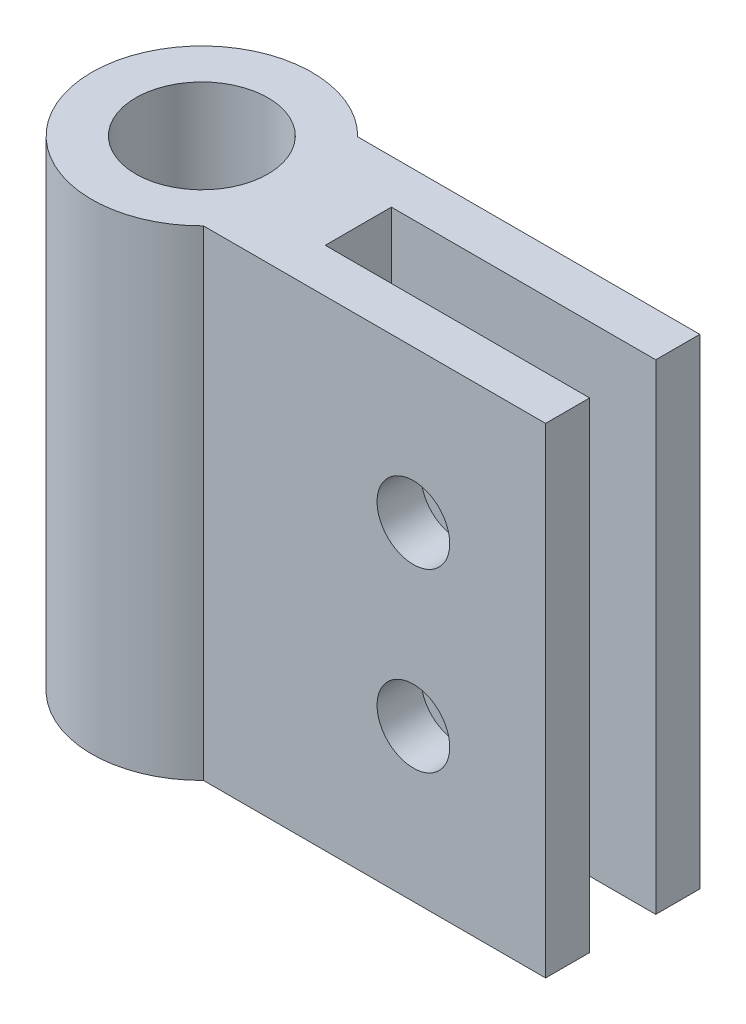
ISO-10303-21;
HEADER;
FILE_DESCRIPTION(('STEP AP214'),'2;1');
FILE_NAME('part.step','',(''),(''),'','','');
FILE_SCHEMA(('AUTOMOTIVE_DESIGN { 1 0 10303 214 1 1 1 1 }'));
ENDSEC;
DATA;
#1=APPLICATION_CONTEXT('core data for automotive mechanical design processes');
#2=APPLICATION_PROTOCOL_DEFINITION('international standard','automotive_design',2000,#1);
#3=PRODUCT_CONTEXT('',#1,'mechanical');
#4=PRODUCT('Part','Part','',(#3));
#5=PRODUCT_RELATED_PRODUCT_CATEGORY('part','',(#4));
#6=PRODUCT_DEFINITION_FORMATION('','',#4);
#7=PRODUCT_DEFINITION_CONTEXT('part definition',#1,'design');
#8=PRODUCT_DEFINITION('design','',#6,#7);
#9=PRODUCT_DEFINITION_SHAPE('','',#8);
#10=(LENGTH_UNIT() NAMED_UNIT(*) SI_UNIT(.MILLI.,.METRE.));
#11=(NAMED_UNIT(*) PLANE_ANGLE_UNIT() SI_UNIT($,.RADIAN.));
#12=(NAMED_UNIT(*) SI_UNIT($,.STERADIAN.) SOLID_ANGLE_UNIT());
#13=UNCERTAINTY_MEASURE_WITH_UNIT(LENGTH_MEASURE(1.E-05),#10,'distance_accuracy_value','');
#14=(GEOMETRIC_REPRESENTATION_CONTEXT(3) GLOBAL_UNCERTAINTY_ASSIGNED_CONTEXT((#13)) GLOBAL_UNIT_ASSIGNED_CONTEXT((#10,
#11,#12)) REPRESENTATION_CONTEXT('',''));
#15=CARTESIAN_POINT('',(0.,0.,0.));
#16=DIRECTION('',(0.,0.,1.));
#17=DIRECTION('',(1.,0.,0.));
#18=AXIS2_PLACEMENT_3D('',#15,#16,#17);
#19=CARTESIAN_POINT('',(19.1,-17.464249196573,3.5));
#20=DIRECTION('',(1.,0.,0.));
#21=DIRECTION('',(0.,0.,-1.));
#22=AXIS2_PLACEMENT_3D('',#19,#20,#21);
#23=PLANE('',#22);
#24=DIRECTION('',(0.,-1.,0.));
#25=VECTOR('',#24,1.);
#26=CARTESIAN_POINT('',(19.1,-17.464249196573,1.5));
#27=LINE('',#26,#25);
#28=CARTESIAN_POINT('',(19.1,21.8,1.5));
#29=VERTEX_POINT('',#28);
#30=CARTESIAN_POINT('',(19.1,0.,1.5));
#31=VERTEX_POINT('',#30);
#32=EDGE_CURVE('E48',#29,#31,#27,.T.);
#33=ORIENTED_EDGE('',*,*,#32,.F.);
#34=DIRECTION('',(0.,0.,-1.));
#35=VECTOR('',#34,1.);
#36=CARTESIAN_POINT('',(19.1,21.8,3.5));
#37=LINE('',#36,#35);
#38=CARTESIAN_POINT('',(19.1,21.8,3.5));
#39=VERTEX_POINT('',#38);
#40=EDGE_CURVE('E131',#39,#29,#37,.T.);
#41=ORIENTED_EDGE('',*,*,#40,.F.);
#42=DIRECTION('',(0.,1.,0.));
#43=VECTOR('',#42,1.);
#44=CARTESIAN_POINT('',(19.1,-17.464249196573,3.5));
#45=LINE('',#44,#43);
#46=CARTESIAN_POINT('',(19.1,0.,3.5));
#47=VERTEX_POINT('',#46);
#48=EDGE_CURVE('E141',#47,#39,#45,.T.);
#49=ORIENTED_EDGE('',*,*,#48,.F.);
#50=DIRECTION('',(0.,0.,1.));
#51=VECTOR('',#50,1.);
#52=CARTESIAN_POINT('',(19.1,0.,3.5));
#53=LINE('',#52,#51);
#54=EDGE_CURVE('E143',#31,#47,#53,.T.);
#55=ORIENTED_EDGE('',*,*,#54,.F.);
#56=EDGE_LOOP('',(#33,#41,#49,#55));
#57=FACE_BOUND('',#56,.T.);
#58=ADVANCED_FACE('F39',(#57),#23,.T.);
#59=CARTESIAN_POINT('',(0.,21.8,0.));
#60=DIRECTION('',(0.,1.,0.));
#61=DIRECTION('',(0.,0.,1.));
#62=AXIS2_PLACEMENT_3D('',#59,#60,#61);
#63=PLANE('',#62);
#64=DIRECTION('',(1.,0.,0.));
#65=VECTOR('',#64,1.);
#66=CARTESIAN_POINT('',(7.1,21.8,1.5));
#67=LINE('',#66,#65);
#68=CARTESIAN_POINT('',(7.1,21.8,1.5));
#69=VERTEX_POINT('',#68);
#70=EDGE_CURVE('E188',#69,#29,#67,.T.);
#71=ORIENTED_EDGE('',*,*,#70,.F.);
#72=DIRECTION('',(0.,0.,1.));
#73=VECTOR('',#72,1.);
#74=CARTESIAN_POINT('',(7.1,21.8,1.5));
#75=LINE('',#74,#73);
#76=CARTESIAN_POINT('',(7.1,21.8,-1.5));
#77=VERTEX_POINT('',#76);
#78=EDGE_CURVE('E124',#77,#69,#75,.T.);
#79=ORIENTED_EDGE('',*,*,#78,.F.);
#80=DIRECTION('',(-1.,0.,0.));
#81=VECTOR('',#80,1.);
#82=CARTESIAN_POINT('',(7.1,21.8,-1.5));
#83=LINE('',#82,#81);
#84=CARTESIAN_POINT('',(19.1,21.8,-1.5));
#85=VERTEX_POINT('',#84);
#86=EDGE_CURVE('E108',#85,#77,#83,.T.);
#87=ORIENTED_EDGE('',*,*,#86,.F.);
#88=CARTESIAN_POINT('',(19.1,21.8,-3.5));
#89=VERTEX_POINT('',#88);
#90=EDGE_CURVE('E121',#85,#89,#37,.T.);
#91=ORIENTED_EDGE('',*,*,#90,.T.);
#92=DIRECTION('',(-1.,0.,0.));
#93=VECTOR('',#92,1.);
#94=CARTESIAN_POINT('',(19.1,21.8,-3.5));
#95=LINE('',#94,#93);
#96=CARTESIAN_POINT('',(3.57071421427143,21.8,-3.5));
#97=VERTEX_POINT('',#96);
#98=EDGE_CURVE('E135',#89,#97,#95,.T.);
#99=ORIENTED_EDGE('',*,*,#98,.T.);
#100=CARTESIAN_POINT('',(0.,21.8,0.));
#101=DIRECTION('',(0.,1.,0.));
#102=DIRECTION('',(0.,0.,1.));
#103=AXIS2_PLACEMENT_3D('',#100,#101,#102);
#104=CIRCLE('',#103,5.);
#105=CARTESIAN_POINT('',(3.57071421427142,21.8,3.5));
#106=VERTEX_POINT('',#105);
#107=EDGE_CURVE('E156',#97,#106,#104,.T.);
#108=ORIENTED_EDGE('',*,*,#107,.T.);
#109=DIRECTION('',(1.,0.,0.));
#110=VECTOR('',#109,1.);
#111=CARTESIAN_POINT('',(19.1,21.8,3.5));
#112=LINE('',#111,#110);
#113=EDGE_CURVE('E132',#106,#39,#112,.T.);
#114=ORIENTED_EDGE('',*,*,#113,.T.);
#115=ORIENTED_EDGE('',*,*,#40,.T.);
#116=EDGE_LOOP('',(#71,#79,#87,#91,#99,#108,#114,#115));
#117=FACE_BOUND('',#116,.T.);
#118=CARTESIAN_POINT('',(0.,21.8,0.));
#119=DIRECTION('',(0.,1.,0.));
#120=DIRECTION('',(0.,0.,1.));
#121=AXIS2_PLACEMENT_3D('',#118,#119,#120);
#122=CIRCLE('',#121,3.);
#123=CARTESIAN_POINT('',(0.,21.8,3.));
#124=VERTEX_POINT('',#123);
#125=EDGE_CURVE('E151',#124,#124,#122,.T.);
#126=ORIENTED_EDGE('',*,*,#125,.F.);
#127=EDGE_LOOP('',(#126));
#128=FACE_BOUND('',#127,.T.);
#129=ADVANCED_FACE('F118',(#117,#128),#63,.T.);
#130=CARTESIAN_POINT('',(0.,0.,0.));
#131=DIRECTION('',(0.,1.,0.));
#132=DIRECTION('',(0.,0.,1.));
#133=AXIS2_PLACEMENT_3D('',#130,#131,#132);
#134=PLANE('',#133);
#135=DIRECTION('',(0.,0.,1.));
#136=VECTOR('',#135,1.);
#137=CARTESIAN_POINT('',(7.1,0.,0.));
#138=LINE('',#137,#136);
#139=CARTESIAN_POINT('',(7.1,0.,-1.5));
#140=VERTEX_POINT('',#139);
#141=CARTESIAN_POINT('',(7.1,0.,1.5));
#142=VERTEX_POINT('',#141);
#143=EDGE_CURVE('E11',#140,#142,#138,.T.);
#144=ORIENTED_EDGE('',*,*,#143,.T.);
#145=DIRECTION('',(1.,0.,0.));
#146=VECTOR('',#145,1.);
#147=CARTESIAN_POINT('',(0.,0.,1.5));
#148=LINE('',#147,#146);
#149=EDGE_CURVE('E136',#142,#31,#148,.T.);
#150=ORIENTED_EDGE('',*,*,#149,.T.);
#151=ORIENTED_EDGE('',*,*,#54,.T.);
#152=DIRECTION('',(-1.,0.,0.));
#153=VECTOR('',#152,1.);
#154=CARTESIAN_POINT('',(19.1,0.,3.5));
#155=LINE('',#154,#153);
#156=CARTESIAN_POINT('',(3.57071421427142,0.,3.5));
#157=VERTEX_POINT('',#156);
#158=EDGE_CURVE('E146',#47,#157,#155,.T.);
#159=ORIENTED_EDGE('',*,*,#158,.T.);
#160=CARTESIAN_POINT('',(0.,0.,0.));
#161=DIRECTION('',(0.,1.,0.));
#162=DIRECTION('',(0.,0.,1.));
#163=AXIS2_PLACEMENT_3D('',#160,#161,#162);
#164=CIRCLE('',#163,5.);
#165=CARTESIAN_POINT('',(3.57071421427143,0.,-3.5));
#166=VERTEX_POINT('',#165);
#167=EDGE_CURVE('E64',#166,#157,#164,.T.);
#168=ORIENTED_EDGE('',*,*,#167,.F.);
#169=DIRECTION('',(1.,0.,0.));
#170=VECTOR('',#169,1.);
#171=CARTESIAN_POINT('',(19.1,0.,-3.5));
#172=LINE('',#171,#170);
#173=CARTESIAN_POINT('',(19.1,0.,-3.5));
#174=VERTEX_POINT('',#173);
#175=EDGE_CURVE('E150',#166,#174,#172,.T.);
#176=ORIENTED_EDGE('',*,*,#175,.T.);
#177=CARTESIAN_POINT('',(19.1,0.,-1.5));
#178=VERTEX_POINT('',#177);
#179=EDGE_CURVE('E197',#174,#178,#53,.T.);
#180=ORIENTED_EDGE('',*,*,#179,.T.);
#181=DIRECTION('',(-1.,0.,0.));
#182=VECTOR('',#181,1.);
#183=CARTESIAN_POINT('',(0.,0.,-1.5));
#184=LINE('',#183,#182);
#185=EDGE_CURVE('E56',#178,#140,#184,.T.);
#186=ORIENTED_EDGE('',*,*,#185,.T.);
#187=EDGE_LOOP('',(#144,#150,#151,#159,#168,#176,#180,#186));
#188=FACE_BOUND('',#187,.T.);
#189=CARTESIAN_POINT('',(0.,0.,0.));
#190=DIRECTION('',(0.,1.,0.));
#191=DIRECTION('',(0.,0.,1.));
#192=AXIS2_PLACEMENT_3D('',#189,#190,#191);
#193=CIRCLE('',#192,3.);
#194=CARTESIAN_POINT('',(0.,0.,3.));
#195=VERTEX_POINT('',#194);
#196=EDGE_CURVE('E149',#195,#195,#193,.T.);
#197=ORIENTED_EDGE('',*,*,#196,.T.);
#198=EDGE_LOOP('',(#197));
#199=FACE_BOUND('',#198,.T.);
#200=ADVANCED_FACE('F200',(#188,#199),#134,.F.);
#201=CARTESIAN_POINT('',(0.,21.8,0.));
#202=DIRECTION('',(0.,-1.,0.));
#203=DIRECTION('',(0.,0.,-1.));
#204=AXIS2_PLACEMENT_3D('',#201,#202,#203);
#205=CYLINDRICAL_SURFACE('',#204,5.);
#206=ORIENTED_EDGE('',*,*,#107,.F.);
#207=DIRECTION('',(0.,-1.,0.));
#208=VECTOR('',#207,1.);
#209=CARTESIAN_POINT('',(3.57071421427143,21.8,-3.5));
#210=LINE('',#209,#208);
#211=EDGE_CURVE('E114',#97,#166,#210,.T.);
#212=ORIENTED_EDGE('',*,*,#211,.T.);
#213=ORIENTED_EDGE('',*,*,#167,.T.);
#214=DIRECTION('',(0.,-1.,0.));
#215=VECTOR('',#214,1.);
#216=CARTESIAN_POINT('',(3.57071421427142,21.8,3.5));
#217=LINE('',#216,#215);
#218=EDGE_CURVE('E159',#157,#106,#217,.F.);
#219=ORIENTED_EDGE('',*,*,#218,.T.);
#220=EDGE_LOOP('',(#206,#212,#213,#219));
#221=FACE_BOUND('',#220,.T.);
#222=ADVANCED_FACE('F41',(#221),#205,.T.);
#223=CARTESIAN_POINT('',(0.,21.8,0.));
#224=DIRECTION('',(0.,-1.,0.));
#225=DIRECTION('',(0.,0.,-1.));
#226=AXIS2_PLACEMENT_3D('',#223,#224,#225);
#227=CYLINDRICAL_SURFACE('',#226,3.);
#228=ORIENTED_EDGE('',*,*,#125,.T.);
#229=EDGE_LOOP('',(#228));
#230=FACE_BOUND('',#229,.T.);
#231=ORIENTED_EDGE('',*,*,#196,.F.);
#232=EDGE_LOOP('',(#231));
#233=FACE_BOUND('',#232,.T.);
#234=ADVANCED_FACE('F241',(#230,#233),#227,.F.);
#235=CARTESIAN_POINT('',(19.1,-17.464249196573,-3.5));
#236=DIRECTION('',(0.,0.,-1.));
#237=DIRECTION('',(-1.,0.,0.));
#238=AXIS2_PLACEMENT_3D('',#235,#236,#237);
#239=PLANE('',#238);
#240=CARTESIAN_POINT('',(13.1,14.9,-3.5));
#241=DIRECTION('',(0.,0.,-1.));
#242=DIRECTION('',(-1.,0.,0.));
#243=AXIS2_PLACEMENT_3D('',#240,#241,#242);
#244=CIRCLE('',#243,1.65);
#245=CARTESIAN_POINT('',(11.45,14.9,-3.5));
#246=VERTEX_POINT('',#245);
#247=EDGE_CURVE('E125',#246,#246,#244,.T.);
#248=ORIENTED_EDGE('',*,*,#247,.F.);
#249=EDGE_LOOP('',(#248));
#250=FACE_BOUND('',#249,.T.);
#251=CARTESIAN_POINT('',(13.1,6.9,-3.5));
#252=DIRECTION('',(0.,0.,-1.));
#253=DIRECTION('',(-1.,0.,0.));
#254=AXIS2_PLACEMENT_3D('',#251,#252,#253);
#255=CIRCLE('',#254,1.65);
#256=CARTESIAN_POINT('',(11.45,6.9,-3.5));
#257=VERTEX_POINT('',#256);
#258=EDGE_CURVE('E170',#257,#257,#255,.T.);
#259=ORIENTED_EDGE('',*,*,#258,.F.);
#260=EDGE_LOOP('',(#259));
#261=FACE_BOUND('',#260,.T.);
#262=ORIENTED_EDGE('',*,*,#211,.F.);
#263=ORIENTED_EDGE('',*,*,#98,.F.);
#264=DIRECTION('',(0.,1.,0.));
#265=VECTOR('',#264,1.);
#266=CARTESIAN_POINT('',(19.1,-17.464249196573,-3.5));
#267=LINE('',#266,#265);
#268=EDGE_CURVE('E129',#174,#89,#267,.T.);
#269=ORIENTED_EDGE('',*,*,#268,.F.);
#270=ORIENTED_EDGE('',*,*,#175,.F.);
#271=EDGE_LOOP('',(#262,#263,#269,#270));
#272=FACE_BOUND('',#271,.T.);
#273=ADVANCED_FACE('F204',(#250,#261,#272),#239,.T.);
#274=CARTESIAN_POINT('',(19.1,-17.464249196573,3.5));
#275=DIRECTION('',(0.,0.,1.));
#276=DIRECTION('',(1.,0.,0.));
#277=AXIS2_PLACEMENT_3D('',#274,#275,#276);
#278=PLANE('',#277);
#279=CARTESIAN_POINT('',(13.1,14.9,3.5));
#280=DIRECTION('',(0.,0.,1.));
#281=DIRECTION('',(1.,0.,0.));
#282=AXIS2_PLACEMENT_3D('',#279,#280,#281);
#283=CIRCLE('',#282,1.65);
#284=CARTESIAN_POINT('',(14.75,14.9,3.5));
#285=VERTEX_POINT('',#284);
#286=EDGE_CURVE('E166',#285,#285,#283,.T.);
#287=ORIENTED_EDGE('',*,*,#286,.F.);
#288=EDGE_LOOP('',(#287));
#289=FACE_BOUND('',#288,.T.);
#290=CARTESIAN_POINT('',(13.1,6.9,3.5));
#291=DIRECTION('',(0.,0.,1.));
#292=DIRECTION('',(1.,0.,0.));
#293=AXIS2_PLACEMENT_3D('',#290,#291,#292);
#294=CIRCLE('',#293,1.65);
#295=CARTESIAN_POINT('',(14.75,6.9,3.5));
#296=VERTEX_POINT('',#295);
#297=EDGE_CURVE('E173',#296,#296,#294,.T.);
#298=ORIENTED_EDGE('',*,*,#297,.F.);
#299=EDGE_LOOP('',(#298));
#300=FACE_BOUND('',#299,.T.);
#301=ORIENTED_EDGE('',*,*,#218,.F.);
#302=ORIENTED_EDGE('',*,*,#158,.F.);
#303=ORIENTED_EDGE('',*,*,#48,.T.);
#304=ORIENTED_EDGE('',*,*,#113,.F.);
#305=EDGE_LOOP('',(#301,#302,#303,#304));
#306=FACE_BOUND('',#305,.T.);
#307=ADVANCED_FACE('F207',(#289,#300,#306),#278,.T.);
#308=DIRECTION('',(0.,1.,0.));
#309=VECTOR('',#308,1.);
#310=CARTESIAN_POINT('',(19.1,-17.464249196573,-1.5));
#311=LINE('',#310,#309);
#312=EDGE_CURVE('E105',#178,#85,#311,.T.);
#313=ORIENTED_EDGE('',*,*,#312,.F.);
#314=ORIENTED_EDGE('',*,*,#179,.F.);
#315=ORIENTED_EDGE('',*,*,#268,.T.);
#316=ORIENTED_EDGE('',*,*,#90,.F.);
#317=EDGE_LOOP('',(#313,#314,#315,#316));
#318=FACE_BOUND('',#317,.T.);
#319=ADVANCED_FACE('F127',(#318),#23,.T.);
#320=CARTESIAN_POINT('',(7.1,-0.199999999999999,1.5));
#321=DIRECTION('',(-1.,0.,0.));
#322=DIRECTION('',(0.,0.,1.));
#323=AXIS2_PLACEMENT_3D('',#320,#321,#322);
#324=PLANE('',#323);
#325=DIRECTION('',(0.,1.,0.));
#326=VECTOR('',#325,1.);
#327=CARTESIAN_POINT('',(7.1,-0.199999999999999,-1.5));
#328=LINE('',#327,#326);
#329=EDGE_CURVE('E190',#140,#77,#328,.T.);
#330=ORIENTED_EDGE('',*,*,#329,.T.);
#331=ORIENTED_EDGE('',*,*,#78,.T.);
#332=DIRECTION('',(0.,1.,0.));
#333=VECTOR('',#332,1.);
#334=CARTESIAN_POINT('',(7.1,-0.199999999999999,1.5));
#335=LINE('',#334,#333);
#336=EDGE_CURVE('E191',#142,#69,#335,.T.);
#337=ORIENTED_EDGE('',*,*,#336,.F.);
#338=ORIENTED_EDGE('',*,*,#143,.F.);
#339=EDGE_LOOP('',(#330,#331,#337,#338));
#340=FACE_BOUND('',#339,.T.);
#341=ADVANCED_FACE('F218',(#340),#324,.F.);
#342=CARTESIAN_POINT('',(7.1,-0.199999999999999,1.5));
#343=DIRECTION('',(0.,0.,1.));
#344=DIRECTION('',(1.,0.,0.));
#345=AXIS2_PLACEMENT_3D('',#342,#343,#344);
#346=PLANE('',#345);
#347=CARTESIAN_POINT('',(13.1,14.9,1.5));
#348=DIRECTION('',(0.,0.,1.));
#349=DIRECTION('',(1.,0.,0.));
#350=AXIS2_PLACEMENT_3D('',#347,#348,#349);
#351=CIRCLE('',#350,1.65);
#352=CARTESIAN_POINT('',(14.75,14.9,1.5));
#353=VERTEX_POINT('',#352);
#354=EDGE_CURVE('E182',#353,#353,#351,.T.);
#355=ORIENTED_EDGE('',*,*,#354,.T.);
#356=EDGE_LOOP('',(#355));
#357=FACE_BOUND('',#356,.T.);
#358=CARTESIAN_POINT('',(13.1,6.9,1.5));
#359=DIRECTION('',(0.,0.,1.));
#360=DIRECTION('',(1.,0.,0.));
#361=AXIS2_PLACEMENT_3D('',#358,#359,#360);
#362=CIRCLE('',#361,1.65);
#363=CARTESIAN_POINT('',(14.75,6.9,1.5));
#364=VERTEX_POINT('',#363);
#365=EDGE_CURVE('E165',#364,#364,#362,.T.);
#366=ORIENTED_EDGE('',*,*,#365,.T.);
#367=EDGE_LOOP('',(#366));
#368=FACE_BOUND('',#367,.T.);
#369=ORIENTED_EDGE('',*,*,#336,.T.);
#370=ORIENTED_EDGE('',*,*,#70,.T.);
#371=ORIENTED_EDGE('',*,*,#32,.T.);
#372=ORIENTED_EDGE('',*,*,#149,.F.);
#373=EDGE_LOOP('',(#369,#370,#371,#372));
#374=FACE_BOUND('',#373,.T.);
#375=ADVANCED_FACE('F215',(#357,#368,#374),#346,.F.);
#376=CARTESIAN_POINT('',(7.1,-0.199999999999999,-1.5));
#377=DIRECTION('',(0.,0.,-1.));
#378=DIRECTION('',(-1.,0.,0.));
#379=AXIS2_PLACEMENT_3D('',#376,#377,#378);
#380=PLANE('',#379);
#381=CARTESIAN_POINT('',(13.1,14.9,-1.5));
#382=DIRECTION('',(0.,0.,-1.));
#383=DIRECTION('',(-1.,0.,0.));
#384=AXIS2_PLACEMENT_3D('',#381,#382,#383);
#385=CIRCLE('',#384,1.65);
#386=CARTESIAN_POINT('',(11.45,14.9,-1.5));
#387=VERTEX_POINT('',#386);
#388=EDGE_CURVE('E43',#387,#387,#385,.T.);
#389=ORIENTED_EDGE('',*,*,#388,.T.);
#390=EDGE_LOOP('',(#389));
#391=FACE_BOUND('',#390,.T.);
#392=CARTESIAN_POINT('',(13.1,6.9,-1.5));
#393=DIRECTION('',(0.,0.,-1.));
#394=DIRECTION('',(-1.,0.,0.));
#395=AXIS2_PLACEMENT_3D('',#392,#393,#394);
#396=CIRCLE('',#395,1.65);
#397=CARTESIAN_POINT('',(11.45,6.9,-1.5));
#398=VERTEX_POINT('',#397);
#399=EDGE_CURVE('E163',#398,#398,#396,.T.);
#400=ORIENTED_EDGE('',*,*,#399,.T.);
#401=EDGE_LOOP('',(#400));
#402=FACE_BOUND('',#401,.T.);
#403=ORIENTED_EDGE('',*,*,#312,.T.);
#404=ORIENTED_EDGE('',*,*,#86,.T.);
#405=ORIENTED_EDGE('',*,*,#329,.F.);
#406=ORIENTED_EDGE('',*,*,#185,.F.);
#407=EDGE_LOOP('',(#403,#404,#405,#406));
#408=FACE_BOUND('',#407,.T.);
#409=ADVANCED_FACE('F107',(#391,#402,#408),#380,.F.);
#410=CARTESIAN_POINT('',(13.1,6.9,-18.5));
#411=DIRECTION('',(0.,0.,1.));
#412=DIRECTION('',(1.,0.,0.));
#413=AXIS2_PLACEMENT_3D('',#410,#411,#412);
#414=CYLINDRICAL_SURFACE('',#413,1.65);
#415=ORIENTED_EDGE('',*,*,#258,.T.);
#416=EDGE_LOOP('',(#415));
#417=FACE_BOUND('',#416,.T.);
#418=ORIENTED_EDGE('',*,*,#399,.F.);
#419=EDGE_LOOP('',(#418));
#420=FACE_BOUND('',#419,.T.);
#421=ADVANCED_FACE('F311',(#417,#420),#414,.F.);
#422=CARTESIAN_POINT('',(13.1,14.9,-18.5));
#423=DIRECTION('',(0.,0.,1.));
#424=DIRECTION('',(1.,0.,0.));
#425=AXIS2_PLACEMENT_3D('',#422,#423,#424);
#426=CYLINDRICAL_SURFACE('',#425,1.65);
#427=ORIENTED_EDGE('',*,*,#247,.T.);
#428=EDGE_LOOP('',(#427));
#429=FACE_BOUND('',#428,.T.);
#430=ORIENTED_EDGE('',*,*,#388,.F.);
#431=EDGE_LOOP('',(#430));
#432=FACE_BOUND('',#431,.T.);
#433=ADVANCED_FACE('F320',(#429,#432),#426,.F.);
#434=ORIENTED_EDGE('',*,*,#297,.T.);
#435=EDGE_LOOP('',(#434));
#436=FACE_BOUND('',#435,.T.);
#437=ORIENTED_EDGE('',*,*,#365,.F.);
#438=EDGE_LOOP('',(#437));
#439=FACE_BOUND('',#438,.T.);
#440=ADVANCED_FACE('F323',(#436,#439),#414,.F.);
#441=ORIENTED_EDGE('',*,*,#286,.T.);
#442=EDGE_LOOP('',(#441));
#443=FACE_BOUND('',#442,.T.);
#444=ORIENTED_EDGE('',*,*,#354,.F.);
#445=EDGE_LOOP('',(#444));
#446=FACE_BOUND('',#445,.T.);
#447=ADVANCED_FACE('F333',(#443,#446),#426,.F.);
#448=CLOSED_SHELL('',(#58,#129,#200,#222,#234,#273,#307,#319,#341,#375,#409,#421,#433,#440,#447));
#449=MANIFOLD_SOLID_BREP('B2',#448);
#450=ADVANCED_BREP_SHAPE_REPRESENTATION('',(#18,#449),#14);
#451=SHAPE_DEFINITION_REPRESENTATION(#9,#450);
ENDSEC;
END-ISO-10303-21;
